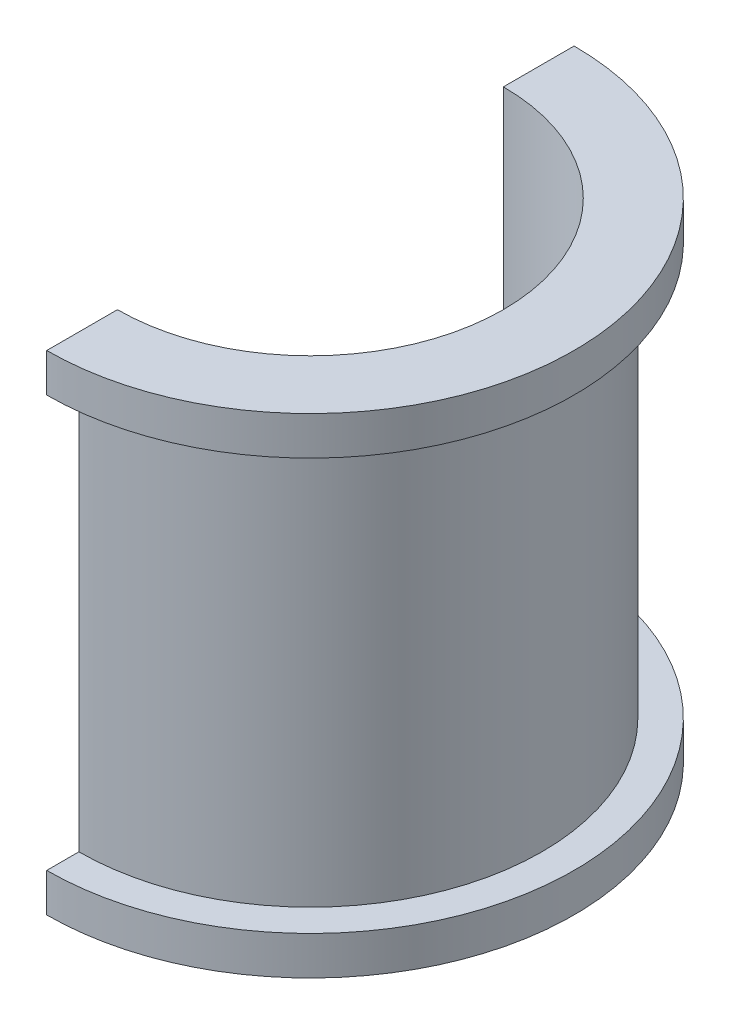
ISO-10303-21;
HEADER;
FILE_DESCRIPTION(('STEP AP214'),'2;1');
FILE_NAME('part.step','',(''),(''),'','','');
FILE_SCHEMA(('AUTOMOTIVE_DESIGN { 1 0 10303 214 1 1 1 1 }'));
ENDSEC;
DATA;
#1=APPLICATION_CONTEXT('core data for automotive mechanical design processes');
#2=APPLICATION_PROTOCOL_DEFINITION('international standard','automotive_design',2000,#1);
#3=PRODUCT_CONTEXT('',#1,'mechanical');
#4=PRODUCT('Part','Part','',(#3));
#5=PRODUCT_RELATED_PRODUCT_CATEGORY('part','',(#4));
#6=PRODUCT_DEFINITION_FORMATION('','',#4);
#7=PRODUCT_DEFINITION_CONTEXT('part definition',#1,'design');
#8=PRODUCT_DEFINITION('design','',#6,#7);
#9=PRODUCT_DEFINITION_SHAPE('','',#8);
#10=(LENGTH_UNIT() NAMED_UNIT(*) SI_UNIT(.MILLI.,.METRE.));
#11=(NAMED_UNIT(*) PLANE_ANGLE_UNIT() SI_UNIT($,.RADIAN.));
#12=(NAMED_UNIT(*) SI_UNIT($,.STERADIAN.) SOLID_ANGLE_UNIT());
#13=UNCERTAINTY_MEASURE_WITH_UNIT(LENGTH_MEASURE(1.E-05),#10,'distance_accuracy_value','');
#14=(GEOMETRIC_REPRESENTATION_CONTEXT(3) GLOBAL_UNCERTAINTY_ASSIGNED_CONTEXT((#13)) GLOBAL_UNIT_ASSIGNED_CONTEXT((#10,
#11,#12)) REPRESENTATION_CONTEXT('',''));
#15=CARTESIAN_POINT('',(0.,0.,0.));
#16=DIRECTION('',(0.,0.,1.));
#17=DIRECTION('',(1.,0.,0.));
#18=AXIS2_PLACEMENT_3D('',#15,#16,#17);
#19=CARTESIAN_POINT('',(0.,0.,0.));
#20=DIRECTION('',(1.,0.,0.));
#21=DIRECTION('',(0.,0.,-1.));
#22=AXIS2_PLACEMENT_3D('',#19,#20,#21);
#23=PLANE('',#22);
#24=DIRECTION('',(0.,0.,-1.));
#25=VECTOR('',#24,1.);
#26=CARTESIAN_POINT('',(0.,3.,0.));
#27=LINE('',#26,#25);
#28=CARTESIAN_POINT('',(0.,3.,20.5));
#29=VERTEX_POINT('',#28);
#30=CARTESIAN_POINT('',(0.,3.,18.));
#31=VERTEX_POINT('',#30);
#32=EDGE_CURVE('E147',#29,#31,#27,.T.);
#33=ORIENTED_EDGE('',*,*,#32,.T.);
#34=DIRECTION('',(0.,-1.,0.));
#35=VECTOR('',#34,1.);
#36=CARTESIAN_POINT('',(0.,35.,18.));
#37=LINE('',#36,#35);
#38=CARTESIAN_POINT('',(0.,35.,18.));
#39=VERTEX_POINT('',#38);
#40=EDGE_CURVE('E150',#39,#31,#37,.T.);
#41=ORIENTED_EDGE('',*,*,#40,.F.);
#42=DIRECTION('',(0.,0.,-1.));
#43=VECTOR('',#42,1.);
#44=CARTESIAN_POINT('',(0.,35.,0.));
#45=LINE('',#44,#43);
#46=CARTESIAN_POINT('',(0.,35.,20.5));
#47=VERTEX_POINT('',#46);
#48=EDGE_CURVE('E113',#47,#39,#45,.T.);
#49=ORIENTED_EDGE('',*,*,#48,.F.);
#50=DIRECTION('',(0.,-1.,0.));
#51=VECTOR('',#50,1.);
#52=CARTESIAN_POINT('',(0.,38.,20.5));
#53=LINE('',#52,#51);
#54=CARTESIAN_POINT('',(0.,38.,20.5));
#55=VERTEX_POINT('',#54);
#56=EDGE_CURVE('E110',#55,#47,#53,.T.);
#57=ORIENTED_EDGE('',*,*,#56,.F.);
#58=DIRECTION('',(0.,0.,-1.));
#59=VECTOR('',#58,1.);
#60=CARTESIAN_POINT('',(0.,38.,0.));
#61=LINE('',#60,#59);
#62=CARTESIAN_POINT('',(0.,38.,15.));
#63=VERTEX_POINT('',#62);
#64=EDGE_CURVE('E45',#55,#63,#61,.T.);
#65=ORIENTED_EDGE('',*,*,#64,.T.);
#66=DIRECTION('',(0.,-1.,0.));
#67=VECTOR('',#66,1.);
#68=CARTESIAN_POINT('',(0.,35.,15.));
#69=LINE('',#68,#67);
#70=CARTESIAN_POINT('',(0.,0.,15.));
#71=VERTEX_POINT('',#70);
#72=EDGE_CURVE('E53',#63,#71,#69,.T.);
#73=ORIENTED_EDGE('',*,*,#72,.T.);
#74=DIRECTION('',(0.,0.,-1.));
#75=VECTOR('',#74,1.);
#76=CARTESIAN_POINT('',(0.,0.,0.));
#77=LINE('',#76,#75);
#78=CARTESIAN_POINT('',(0.,0.,20.5));
#79=VERTEX_POINT('',#78);
#80=EDGE_CURVE('E151',#79,#71,#77,.T.);
#81=ORIENTED_EDGE('',*,*,#80,.F.);
#82=DIRECTION('',(0.,-1.,0.));
#83=VECTOR('',#82,1.);
#84=CARTESIAN_POINT('',(0.,3.,20.5));
#85=LINE('',#84,#83);
#86=EDGE_CURVE('E40',#29,#79,#85,.T.);
#87=ORIENTED_EDGE('',*,*,#86,.F.);
#88=EDGE_LOOP('',(#33,#41,#49,#57,#65,#73,#81,#87));
#89=FACE_BOUND('',#88,.T.);
#90=ADVANCED_FACE('F36',(#89),#23,.F.);
#91=CARTESIAN_POINT('',(0.,3.,-18.));
#92=VERTEX_POINT('',#91);
#93=CARTESIAN_POINT('',(0.,3.,-20.5));
#94=VERTEX_POINT('',#93);
#95=EDGE_CURVE('E108',#92,#94,#27,.T.);
#96=ORIENTED_EDGE('',*,*,#95,.T.);
#97=DIRECTION('',(0.,-1.,0.));
#98=VECTOR('',#97,1.);
#99=CARTESIAN_POINT('',(0.,3.,-20.5));
#100=LINE('',#99,#98);
#101=CARTESIAN_POINT('',(0.,0.,-20.5));
#102=VERTEX_POINT('',#101);
#103=EDGE_CURVE('E143',#102,#94,#100,.F.);
#104=ORIENTED_EDGE('',*,*,#103,.F.);
#105=CARTESIAN_POINT('',(0.,0.,-15.));
#106=VERTEX_POINT('',#105);
#107=EDGE_CURVE('E153',#106,#102,#77,.T.);
#108=ORIENTED_EDGE('',*,*,#107,.F.);
#109=DIRECTION('',(0.,-1.,0.));
#110=VECTOR('',#109,1.);
#111=CARTESIAN_POINT('',(0.,35.,-15.));
#112=LINE('',#111,#110);
#113=CARTESIAN_POINT('',(0.,38.,-15.));
#114=VERTEX_POINT('',#113);
#115=EDGE_CURVE('E145',#106,#114,#112,.F.);
#116=ORIENTED_EDGE('',*,*,#115,.T.);
#117=CARTESIAN_POINT('',(0.,38.,-20.5));
#118=VERTEX_POINT('',#117);
#119=EDGE_CURVE('E12',#114,#118,#61,.T.);
#120=ORIENTED_EDGE('',*,*,#119,.T.);
#121=DIRECTION('',(0.,-1.,0.));
#122=VECTOR('',#121,1.);
#123=CARTESIAN_POINT('',(0.,38.,-20.5));
#124=LINE('',#123,#122);
#125=CARTESIAN_POINT('',(0.,35.,-20.5));
#126=VERTEX_POINT('',#125);
#127=EDGE_CURVE('E118',#126,#118,#124,.F.);
#128=ORIENTED_EDGE('',*,*,#127,.F.);
#129=CARTESIAN_POINT('',(0.,35.,-18.));
#130=VERTEX_POINT('',#129);
#131=EDGE_CURVE('E117',#130,#126,#45,.T.);
#132=ORIENTED_EDGE('',*,*,#131,.F.);
#133=DIRECTION('',(0.,-1.,0.));
#134=VECTOR('',#133,1.);
#135=CARTESIAN_POINT('',(0.,35.,-18.));
#136=LINE('',#135,#134);
#137=EDGE_CURVE('E148',#92,#130,#136,.F.);
#138=ORIENTED_EDGE('',*,*,#137,.F.);
#139=EDGE_LOOP('',(#96,#104,#108,#116,#120,#128,#132,#138));
#140=FACE_BOUND('',#139,.T.);
#141=ADVANCED_FACE('F38',(#140),#23,.F.);
#142=CARTESIAN_POINT('',(0.,35.,0.));
#143=DIRECTION('',(0.,-1.,0.));
#144=DIRECTION('',(0.,0.,-1.));
#145=AXIS2_PLACEMENT_3D('',#142,#143,#144);
#146=CYLINDRICAL_SURFACE('',#145,15.);
#147=ORIENTED_EDGE('',*,*,#72,.F.);
#148=CARTESIAN_POINT('',(0.,38.,0.));
#149=DIRECTION('',(0.,1.,0.));
#150=DIRECTION('',(0.,0.,1.));
#151=AXIS2_PLACEMENT_3D('',#148,#149,#150);
#152=CIRCLE('',#151,15.);
#153=EDGE_CURVE('E106',#63,#114,#152,.T.);
#154=ORIENTED_EDGE('',*,*,#153,.T.);
#155=ORIENTED_EDGE('',*,*,#115,.F.);
#156=CARTESIAN_POINT('',(0.,0.,0.));
#157=DIRECTION('',(0.,1.,0.));
#158=DIRECTION('',(0.,0.,1.));
#159=AXIS2_PLACEMENT_3D('',#156,#157,#158);
#160=CIRCLE('',#159,15.);
#161=EDGE_CURVE('E136',#71,#106,#160,.T.);
#162=ORIENTED_EDGE('',*,*,#161,.F.);
#163=EDGE_LOOP('',(#147,#154,#155,#162));
#164=FACE_BOUND('',#163,.T.);
#165=ADVANCED_FACE('F171',(#164),#146,.F.);
#166=CARTESIAN_POINT('',(0.,35.,0.));
#167=DIRECTION('',(0.,-1.,0.));
#168=DIRECTION('',(0.,0.,-1.));
#169=AXIS2_PLACEMENT_3D('',#166,#167,#168);
#170=CYLINDRICAL_SURFACE('',#169,18.);
#171=CARTESIAN_POINT('',(0.,35.,0.));
#172=DIRECTION('',(0.,1.,0.));
#173=DIRECTION('',(0.,0.,1.));
#174=AXIS2_PLACEMENT_3D('',#171,#172,#173);
#175=CIRCLE('',#174,18.);
#176=EDGE_CURVE('E139',#39,#130,#175,.T.);
#177=ORIENTED_EDGE('',*,*,#176,.F.);
#178=ORIENTED_EDGE('',*,*,#40,.T.);
#179=CARTESIAN_POINT('',(0.,3.,0.));
#180=DIRECTION('',(0.,1.,0.));
#181=DIRECTION('',(0.,0.,1.));
#182=AXIS2_PLACEMENT_3D('',#179,#180,#181);
#183=CIRCLE('',#182,18.);
#184=EDGE_CURVE('E132',#31,#92,#183,.T.);
#185=ORIENTED_EDGE('',*,*,#184,.T.);
#186=ORIENTED_EDGE('',*,*,#137,.T.);
#187=EDGE_LOOP('',(#177,#178,#185,#186));
#188=FACE_BOUND('',#187,.T.);
#189=ADVANCED_FACE('F175',(#188),#170,.T.);
#190=CARTESIAN_POINT('',(0.,35.,0.));
#191=DIRECTION('',(0.,1.,0.));
#192=DIRECTION('',(0.,0.,1.));
#193=AXIS2_PLACEMENT_3D('',#190,#191,#192);
#194=PLANE('',#193);
#195=CARTESIAN_POINT('',(0.,35.,0.));
#196=DIRECTION('',(0.,1.,0.));
#197=DIRECTION('',(0.,0.,1.));
#198=AXIS2_PLACEMENT_3D('',#195,#196,#197);
#199=CIRCLE('',#198,20.5);
#200=EDGE_CURVE('E123',#47,#126,#199,.T.);
#201=ORIENTED_EDGE('',*,*,#200,.F.);
#202=ORIENTED_EDGE('',*,*,#48,.T.);
#203=ORIENTED_EDGE('',*,*,#176,.T.);
#204=ORIENTED_EDGE('',*,*,#131,.T.);
#205=EDGE_LOOP('',(#201,#202,#203,#204));
#206=FACE_BOUND('',#205,.T.);
#207=ADVANCED_FACE('F174',(#206),#194,.F.);
#208=CARTESIAN_POINT('',(0.,38.,0.));
#209=DIRECTION('',(0.,1.,0.));
#210=DIRECTION('',(0.,0.,1.));
#211=AXIS2_PLACEMENT_3D('',#208,#209,#210);
#212=PLANE('',#211);
#213=ORIENTED_EDGE('',*,*,#64,.F.);
#214=CARTESIAN_POINT('',(0.,38.,0.));
#215=DIRECTION('',(0.,1.,0.));
#216=DIRECTION('',(0.,0.,1.));
#217=AXIS2_PLACEMENT_3D('',#214,#215,#216);
#218=CIRCLE('',#217,20.5);
#219=EDGE_CURVE('E105',#55,#118,#218,.T.);
#220=ORIENTED_EDGE('',*,*,#219,.T.);
#221=ORIENTED_EDGE('',*,*,#119,.F.);
#222=ORIENTED_EDGE('',*,*,#153,.F.);
#223=EDGE_LOOP('',(#213,#220,#221,#222));
#224=FACE_BOUND('',#223,.T.);
#225=ADVANCED_FACE('F103',(#224),#212,.T.);
#226=CARTESIAN_POINT('',(0.,38.,0.));
#227=DIRECTION('',(0.,-1.,0.));
#228=DIRECTION('',(0.,0.,-1.));
#229=AXIS2_PLACEMENT_3D('',#226,#227,#228);
#230=CYLINDRICAL_SURFACE('',#229,20.5);
#231=ORIENTED_EDGE('',*,*,#219,.F.);
#232=ORIENTED_EDGE('',*,*,#56,.T.);
#233=ORIENTED_EDGE('',*,*,#200,.T.);
#234=ORIENTED_EDGE('',*,*,#127,.T.);
#235=EDGE_LOOP('',(#231,#232,#233,#234));
#236=FACE_BOUND('',#235,.T.);
#237=ADVANCED_FACE('F120',(#236),#230,.T.);
#238=CARTESIAN_POINT('',(0.,0.,0.));
#239=DIRECTION('',(0.,1.,0.));
#240=DIRECTION('',(0.,0.,1.));
#241=AXIS2_PLACEMENT_3D('',#238,#239,#240);
#242=PLANE('',#241);
#243=CARTESIAN_POINT('',(0.,0.,0.));
#244=DIRECTION('',(0.,1.,0.));
#245=DIRECTION('',(0.,0.,1.));
#246=AXIS2_PLACEMENT_3D('',#243,#244,#245);
#247=CIRCLE('',#246,20.5);
#248=EDGE_CURVE('E122',#79,#102,#247,.T.);
#249=ORIENTED_EDGE('',*,*,#248,.F.);
#250=ORIENTED_EDGE('',*,*,#80,.T.);
#251=ORIENTED_EDGE('',*,*,#161,.T.);
#252=ORIENTED_EDGE('',*,*,#107,.T.);
#253=EDGE_LOOP('',(#249,#250,#251,#252));
#254=FACE_BOUND('',#253,.T.);
#255=ADVANCED_FACE('F163',(#254),#242,.F.);
#256=CARTESIAN_POINT('',(0.,3.,0.));
#257=DIRECTION('',(0.,1.,0.));
#258=DIRECTION('',(0.,0.,1.));
#259=AXIS2_PLACEMENT_3D('',#256,#257,#258);
#260=PLANE('',#259);
#261=ORIENTED_EDGE('',*,*,#32,.F.);
#262=CARTESIAN_POINT('',(0.,3.,0.));
#263=DIRECTION('',(0.,1.,0.));
#264=DIRECTION('',(0.,0.,1.));
#265=AXIS2_PLACEMENT_3D('',#262,#263,#264);
#266=CIRCLE('',#265,20.5);
#267=EDGE_CURVE('E126',#29,#94,#266,.T.);
#268=ORIENTED_EDGE('',*,*,#267,.T.);
#269=ORIENTED_EDGE('',*,*,#95,.F.);
#270=ORIENTED_EDGE('',*,*,#184,.F.);
#271=EDGE_LOOP('',(#261,#268,#269,#270));
#272=FACE_BOUND('',#271,.T.);
#273=ADVANCED_FACE('F178',(#272),#260,.T.);
#274=CARTESIAN_POINT('',(0.,3.,0.));
#275=DIRECTION('',(0.,-1.,0.));
#276=DIRECTION('',(0.,0.,-1.));
#277=AXIS2_PLACEMENT_3D('',#274,#275,#276);
#278=CYLINDRICAL_SURFACE('',#277,20.5);
#279=ORIENTED_EDGE('',*,*,#267,.F.);
#280=ORIENTED_EDGE('',*,*,#86,.T.);
#281=ORIENTED_EDGE('',*,*,#248,.T.);
#282=ORIENTED_EDGE('',*,*,#103,.T.);
#283=EDGE_LOOP('',(#279,#280,#281,#282));
#284=FACE_BOUND('',#283,.T.);
#285=ADVANCED_FACE('F168',(#284),#278,.T.);
#286=CLOSED_SHELL('',(#90,#141,#165,#189,#207,#225,#237,#255,#273,#285));
#287=MANIFOLD_SOLID_BREP('B2',#286);
#288=ADVANCED_BREP_SHAPE_REPRESENTATION('',(#18,#287),#14);
#289=SHAPE_DEFINITION_REPRESENTATION(#9,#288);
ENDSEC;
END-ISO-10303-21;
